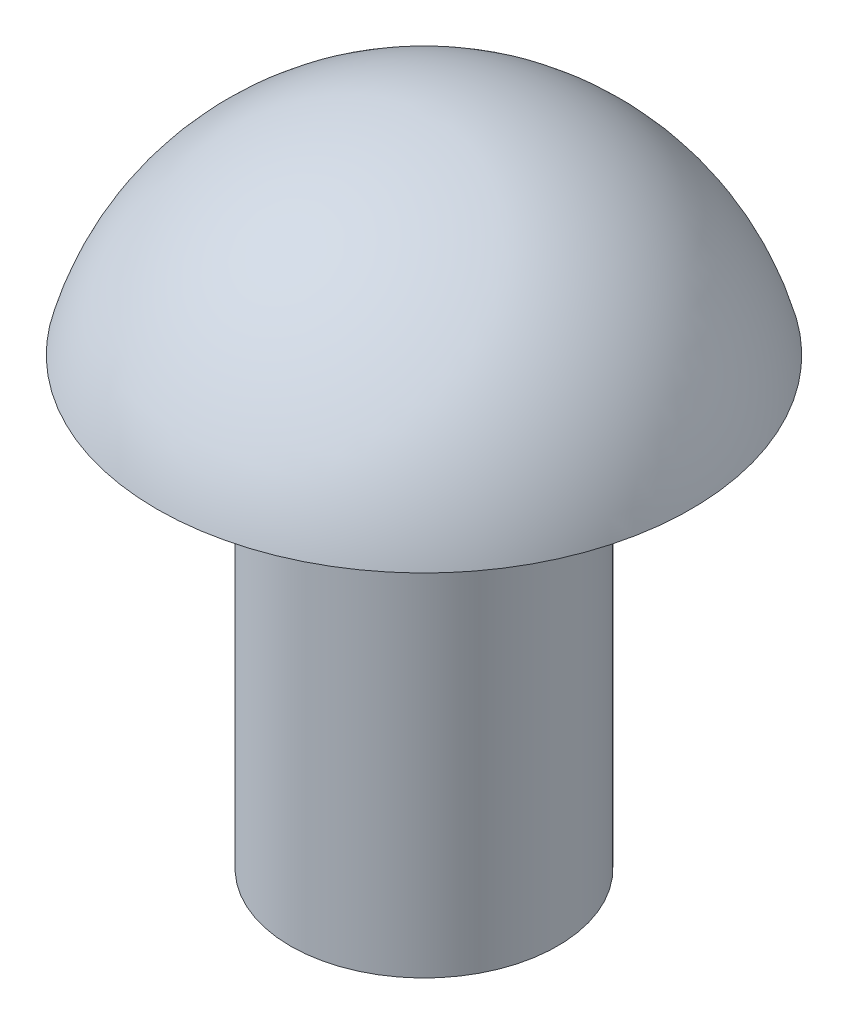
ISO-10303-21;
HEADER;
FILE_DESCRIPTION(('STEP AP214'),'2;1');
FILE_NAME('part.step','',(''),(''),'','','');
FILE_SCHEMA(('AUTOMOTIVE_DESIGN { 1 0 10303 214 1 1 1 1 }'));
ENDSEC;
DATA;
#1=APPLICATION_CONTEXT('core data for automotive mechanical design processes');
#2=APPLICATION_PROTOCOL_DEFINITION('international standard','automotive_design',2000,#1);
#3=PRODUCT_CONTEXT('',#1,'mechanical');
#4=PRODUCT('Part','Part','',(#3));
#5=PRODUCT_RELATED_PRODUCT_CATEGORY('part','',(#4));
#6=PRODUCT_DEFINITION_FORMATION('','',#4);
#7=PRODUCT_DEFINITION_CONTEXT('part definition',#1,'design');
#8=PRODUCT_DEFINITION('design','',#6,#7);
#9=PRODUCT_DEFINITION_SHAPE('','',#8);
#10=(LENGTH_UNIT() NAMED_UNIT(*) SI_UNIT(.MILLI.,.METRE.));
#11=(NAMED_UNIT(*) PLANE_ANGLE_UNIT() SI_UNIT($,.RADIAN.));
#12=(NAMED_UNIT(*) SI_UNIT($,.STERADIAN.) SOLID_ANGLE_UNIT());
#13=UNCERTAINTY_MEASURE_WITH_UNIT(LENGTH_MEASURE(1.E-05),#10,'distance_accuracy_value','');
#14=(GEOMETRIC_REPRESENTATION_CONTEXT(3) GLOBAL_UNCERTAINTY_ASSIGNED_CONTEXT((#13)) GLOBAL_UNIT_ASSIGNED_CONTEXT((#10,
#11,#12)) REPRESENTATION_CONTEXT('',''));
#15=CARTESIAN_POINT('',(0.,0.,0.));
#16=DIRECTION('',(0.,0.,1.));
#17=DIRECTION('',(1.,0.,0.));
#18=AXIS2_PLACEMENT_3D('',#15,#16,#17);
#19=CARTESIAN_POINT('',(0.,217.463933364541,0.));
#20=DIRECTION('',(0.,-1.,0.));
#21=DIRECTION('',(0.,0.,-1.));
#22=AXIS2_PLACEMENT_3D('',#19,#20,#21);
#23=CYLINDRICAL_SURFACE('',#22,3.00000162);
#24=CARTESIAN_POINT('',(0.,217.463933364541,0.));
#25=DIRECTION('',(0.,1.,0.));
#26=DIRECTION('',(0.,0.,1.));
#27=AXIS2_PLACEMENT_3D('',#24,#25,#26);
#28=CIRCLE('',#27,3.00000162);
#29=CARTESIAN_POINT('',(0.,217.463933364541,3.00000161999999));
#30=VERTEX_POINT('',#29);
#31=EDGE_CURVE('E10',#30,#30,#28,.T.);
#32=ORIENTED_EDGE('',*,*,#31,.F.);
#33=EDGE_LOOP('',(#32));
#34=FACE_BOUND('',#33,.T.);
#35=CARTESIAN_POINT('',(0.,207.463927964541,0.));
#36=DIRECTION('',(0.,1.,0.));
#37=DIRECTION('',(0.,0.,1.));
#38=AXIS2_PLACEMENT_3D('',#35,#36,#37);
#39=CIRCLE('',#38,3.00000162);
#40=CARTESIAN_POINT('',(0.,207.463927964541,3.00000161999999));
#41=VERTEX_POINT('',#40);
#42=EDGE_CURVE('E48',#41,#41,#39,.T.);
#43=ORIENTED_EDGE('',*,*,#42,.T.);
#44=EDGE_LOOP('',(#43));
#45=FACE_BOUND('',#44,.T.);
#46=ADVANCED_FACE('F45',(#34,#45),#23,.T.);
#47=CARTESIAN_POINT('',(0.,207.463927964541,0.));
#48=DIRECTION('',(0.,1.,0.));
#49=DIRECTION('',(0.,0.,1.));
#50=AXIS2_PLACEMENT_3D('',#47,#48,#49);
#51=PLANE('',#50);
#52=ORIENTED_EDGE('',*,*,#42,.F.);
#53=EDGE_LOOP('',(#52));
#54=FACE_BOUND('',#53,.T.);
#55=ADVANCED_FACE('F75',(#54),#51,.F.);
#56=CARTESIAN_POINT('',(0.,217.463933364541,0.));
#57=DIRECTION('',(0.,1.,0.));
#58=DIRECTION('',(0.,0.,1.));
#59=AXIS2_PLACEMENT_3D('',#56,#57,#58);
#60=PLANE('',#59);
#61=ORIENTED_EDGE('',*,*,#31,.T.);
#62=EDGE_LOOP('',(#61));
#63=FACE_BOUND('',#62,.T.);
#64=CARTESIAN_POINT('',(0.,217.463933364541,0.));
#65=DIRECTION('',(0.,-1.,0.));
#66=DIRECTION('',(0.,0.,-1.));
#67=AXIS2_PLACEMENT_3D('',#64,#65,#66);
#68=CIRCLE('',#67,6.00000324);
#69=CARTESIAN_POINT('',(0.,217.463933364541,-6.00000324000001));
#70=VERTEX_POINT('',#69);
#71=EDGE_CURVE('E59',#70,#70,#68,.T.);
#72=ORIENTED_EDGE('',*,*,#71,.T.);
#73=EDGE_LOOP('',(#72));
#74=FACE_BOUND('',#73,.T.);
#75=ADVANCED_FACE('F68',(#63,#74),#60,.F.);
#76=CARTESIAN_POINT('',(0.,215.878568591224,0.));
#77=DIRECTION('',(0.,-1.,0.));
#78=DIRECTION('',(0.,0.,1.));
#79=AXIS2_PLACEMENT_3D('',#76,#77,#78);
#80=SPHERICAL_SURFACE('',#79,6.20591817094665);
#81=ORIENTED_EDGE('',*,*,#71,.F.);
#82=EDGE_LOOP('',(#81));
#83=FACE_BOUND('',#82,.T.);
#84=ADVANCED_FACE('F70',(#83),#80,.T.);
#85=CLOSED_SHELL('',(#46,#55,#75,#84));
#86=MANIFOLD_SOLID_BREP('B2',#85);
#87=ADVANCED_BREP_SHAPE_REPRESENTATION('',(#18,#86),#14);
#88=SHAPE_DEFINITION_REPRESENTATION(#9,#87);
ENDSEC;
END-ISO-10303-21;
